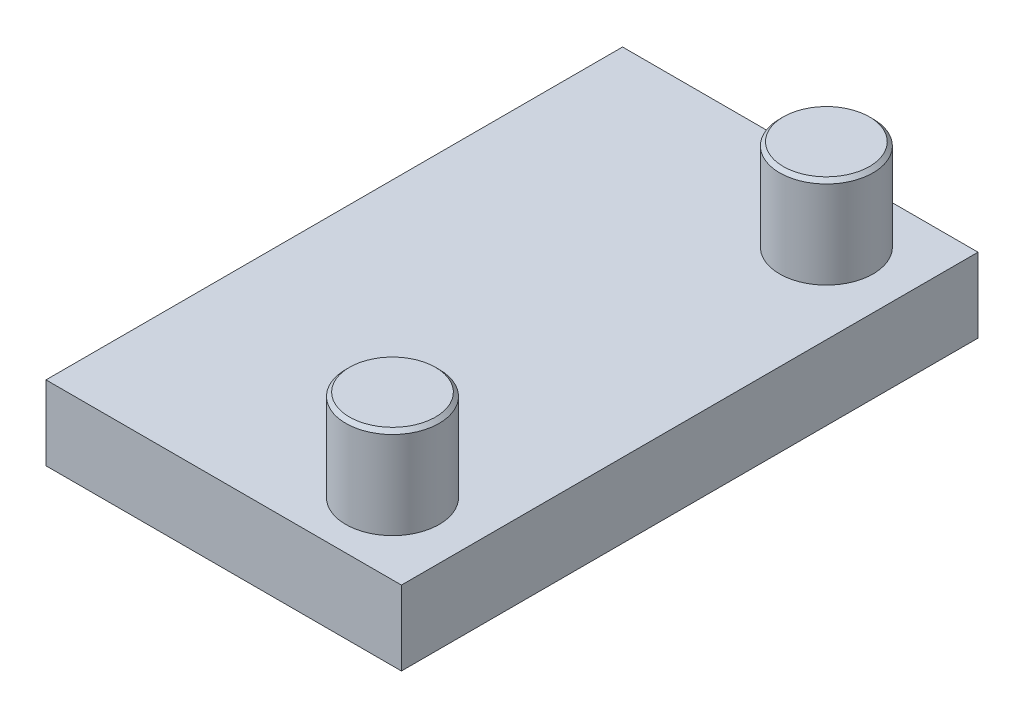
ISO-10303-21;
HEADER;
FILE_DESCRIPTION(('STEP AP214'),'2;1');
FILE_NAME('part.step','',(''),(''),'','','');
FILE_SCHEMA(('AUTOMOTIVE_DESIGN { 1 0 10303 214 1 1 1 1 }'));
ENDSEC;
DATA;
#1=APPLICATION_CONTEXT('core data for automotive mechanical design processes');
#2=APPLICATION_PROTOCOL_DEFINITION('international standard','automotive_design',2000,#1);
#3=PRODUCT_CONTEXT('',#1,'mechanical');
#4=PRODUCT('Part','Part','',(#3));
#5=PRODUCT_RELATED_PRODUCT_CATEGORY('part','',(#4));
#6=PRODUCT_DEFINITION_FORMATION('','',#4);
#7=PRODUCT_DEFINITION_CONTEXT('part definition',#1,'design');
#8=PRODUCT_DEFINITION('design','',#6,#7);
#9=PRODUCT_DEFINITION_SHAPE('','',#8);
#10=(LENGTH_UNIT() NAMED_UNIT(*) SI_UNIT(.MILLI.,.METRE.));
#11=(NAMED_UNIT(*) PLANE_ANGLE_UNIT() SI_UNIT($,.RADIAN.));
#12=(NAMED_UNIT(*) SI_UNIT($,.STERADIAN.) SOLID_ANGLE_UNIT());
#13=UNCERTAINTY_MEASURE_WITH_UNIT(LENGTH_MEASURE(1.E-05),#10,'distance_accuracy_value','');
#14=(GEOMETRIC_REPRESENTATION_CONTEXT(3) GLOBAL_UNCERTAINTY_ASSIGNED_CONTEXT((#13)) GLOBAL_UNIT_ASSIGNED_CONTEXT((#10,
#11,#12)) REPRESENTATION_CONTEXT('',''));
#15=CARTESIAN_POINT('',(0.,0.,0.));
#16=DIRECTION('',(0.,0.,1.));
#17=DIRECTION('',(1.,0.,0.));
#18=AXIS2_PLACEMENT_3D('',#15,#16,#17);
#19=CARTESIAN_POINT('',(6.1849,2.5908,10.033));
#20=DIRECTION('',(-1.,0.,0.));
#21=DIRECTION('',(0.,0.,1.));
#22=AXIS2_PLACEMENT_3D('',#19,#20,#21);
#23=PLANE('',#22);
#24=DIRECTION('',(0.,0.,-1.));
#25=VECTOR('',#24,1.);
#26=CARTESIAN_POINT('',(6.1849,0.,10.033));
#27=LINE('',#26,#25);
#28=CARTESIAN_POINT('',(6.1849,0.,10.033));
#29=VERTEX_POINT('',#28);
#30=CARTESIAN_POINT('',(6.18489999999999,0.,-10.033));
#31=VERTEX_POINT('',#30);
#32=EDGE_CURVE('E109',#29,#31,#27,.T.);
#33=ORIENTED_EDGE('',*,*,#32,.T.);
#34=DIRECTION('',(0.,-1.,0.));
#35=VECTOR('',#34,1.);
#36=CARTESIAN_POINT('',(6.18489999999999,2.5908,-10.033));
#37=LINE('',#36,#35);
#38=CARTESIAN_POINT('',(6.18489999999999,2.5908,-10.033));
#39=VERTEX_POINT('',#38);
#40=EDGE_CURVE('E101',#39,#31,#37,.T.);
#41=ORIENTED_EDGE('',*,*,#40,.F.);
#42=DIRECTION('',(0.,0.,-1.));
#43=VECTOR('',#42,1.);
#44=CARTESIAN_POINT('',(6.1849,2.5908,10.033));
#45=LINE('',#44,#43);
#46=CARTESIAN_POINT('',(6.1849,2.5908,10.033));
#47=VERTEX_POINT('',#46);
#48=EDGE_CURVE('E92',#47,#39,#45,.T.);
#49=ORIENTED_EDGE('',*,*,#48,.F.);
#50=DIRECTION('',(0.,-1.,0.));
#51=VECTOR('',#50,1.);
#52=CARTESIAN_POINT('',(6.1849,2.5908,10.033));
#53=LINE('',#52,#51);
#54=EDGE_CURVE('E106',#47,#29,#53,.T.);
#55=ORIENTED_EDGE('',*,*,#54,.T.);
#56=EDGE_LOOP('',(#33,#41,#49,#55));
#57=FACE_BOUND('',#56,.T.);
#58=ADVANCED_FACE('F41',(#57),#23,.F.);
#59=CARTESIAN_POINT('',(6.18489999999999,2.5908,-10.033));
#60=DIRECTION('',(0.,0.,1.));
#61=DIRECTION('',(1.,0.,0.));
#62=AXIS2_PLACEMENT_3D('',#59,#60,#61);
#63=PLANE('',#62);
#64=DIRECTION('',(-1.,0.,0.));
#65=VECTOR('',#64,1.);
#66=CARTESIAN_POINT('',(6.18489999999999,0.,-10.033));
#67=LINE('',#66,#65);
#68=CARTESIAN_POINT('',(-6.1849,0.,-10.033));
#69=VERTEX_POINT('',#68);
#70=EDGE_CURVE('E99',#31,#69,#67,.T.);
#71=ORIENTED_EDGE('',*,*,#70,.T.);
#72=DIRECTION('',(0.,-1.,0.));
#73=VECTOR('',#72,1.);
#74=CARTESIAN_POINT('',(-6.1849,2.5908,-10.033));
#75=LINE('',#74,#73);
#76=CARTESIAN_POINT('',(-6.1849,2.5908,-10.033));
#77=VERTEX_POINT('',#76);
#78=EDGE_CURVE('E98',#77,#69,#75,.T.);
#79=ORIENTED_EDGE('',*,*,#78,.F.);
#80=DIRECTION('',(-1.,0.,0.));
#81=VECTOR('',#80,1.);
#82=CARTESIAN_POINT('',(6.18489999999999,2.5908,-10.033));
#83=LINE('',#82,#81);
#84=EDGE_CURVE('E89',#39,#77,#83,.T.);
#85=ORIENTED_EDGE('',*,*,#84,.F.);
#86=ORIENTED_EDGE('',*,*,#40,.T.);
#87=EDGE_LOOP('',(#71,#79,#85,#86));
#88=FACE_BOUND('',#87,.T.);
#89=ADVANCED_FACE('F97',(#88),#63,.F.);
#90=CARTESIAN_POINT('',(-6.1849,2.5908,-10.033));
#91=DIRECTION('',(1.,0.,0.));
#92=DIRECTION('',(0.,0.,-1.));
#93=AXIS2_PLACEMENT_3D('',#90,#91,#92);
#94=PLANE('',#93);
#95=DIRECTION('',(0.,0.,1.));
#96=VECTOR('',#95,1.);
#97=CARTESIAN_POINT('',(-6.1849,0.,-10.033));
#98=LINE('',#97,#96);
#99=CARTESIAN_POINT('',(-6.1849,0.,10.033));
#100=VERTEX_POINT('',#99);
#101=EDGE_CURVE('E77',#69,#100,#98,.T.);
#102=ORIENTED_EDGE('',*,*,#101,.T.);
#103=DIRECTION('',(0.,-1.,0.));
#104=VECTOR('',#103,1.);
#105=CARTESIAN_POINT('',(-6.1849,2.5908,10.033));
#106=LINE('',#105,#104);
#107=CARTESIAN_POINT('',(-6.1849,2.5908,10.033));
#108=VERTEX_POINT('',#107);
#109=EDGE_CURVE('E105',#108,#100,#106,.T.);
#110=ORIENTED_EDGE('',*,*,#109,.F.);
#111=DIRECTION('',(0.,0.,1.));
#112=VECTOR('',#111,1.);
#113=CARTESIAN_POINT('',(-6.1849,2.5908,-10.033));
#114=LINE('',#113,#112);
#115=EDGE_CURVE('E91',#77,#108,#114,.T.);
#116=ORIENTED_EDGE('',*,*,#115,.F.);
#117=ORIENTED_EDGE('',*,*,#78,.T.);
#118=EDGE_LOOP('',(#102,#110,#116,#117));
#119=FACE_BOUND('',#118,.T.);
#120=ADVANCED_FACE('F102',(#119),#94,.F.);
#121=CARTESIAN_POINT('',(-6.1849,2.5908,10.033));
#122=DIRECTION('',(0.,0.,-1.));
#123=DIRECTION('',(-1.,0.,0.));
#124=AXIS2_PLACEMENT_3D('',#121,#122,#123);
#125=PLANE('',#124);
#126=DIRECTION('',(1.,0.,0.));
#127=VECTOR('',#126,1.);
#128=CARTESIAN_POINT('',(-6.1849,0.,10.033));
#129=LINE('',#128,#127);
#130=EDGE_CURVE('E85',#100,#29,#129,.T.);
#131=ORIENTED_EDGE('',*,*,#130,.T.);
#132=ORIENTED_EDGE('',*,*,#54,.F.);
#133=DIRECTION('',(1.,0.,0.));
#134=VECTOR('',#133,1.);
#135=CARTESIAN_POINT('',(-6.1849,2.5908,10.033));
#136=LINE('',#135,#134);
#137=EDGE_CURVE('E56',#108,#47,#136,.T.);
#138=ORIENTED_EDGE('',*,*,#137,.F.);
#139=ORIENTED_EDGE('',*,*,#109,.T.);
#140=EDGE_LOOP('',(#131,#132,#138,#139));
#141=FACE_BOUND('',#140,.T.);
#142=ADVANCED_FACE('F152',(#141),#125,.F.);
#143=CARTESIAN_POINT('',(0.,2.5908,0.));
#144=DIRECTION('',(0.,1.,0.));
#145=DIRECTION('',(0.,0.,1.));
#146=AXIS2_PLACEMENT_3D('',#143,#144,#145);
#147=PLANE('',#146);
#148=CARTESIAN_POINT('',(3.3909,2.5908,-7.55015));
#149=DIRECTION('',(0.,1.,0.));
#150=DIRECTION('',(0.,0.,1.));
#151=AXIS2_PLACEMENT_3D('',#148,#149,#150);
#152=CIRCLE('',#151,1.62559999999989);
#153=CARTESIAN_POINT('',(3.3909,2.5908,-5.92455000000011));
#154=VERTEX_POINT('',#153);
#155=EDGE_CURVE('E124',#154,#154,#152,.T.);
#156=ORIENTED_EDGE('',*,*,#155,.F.);
#157=EDGE_LOOP('',(#156));
#158=FACE_BOUND('',#157,.T.);
#159=CARTESIAN_POINT('',(3.3909,2.5908,7.55015));
#160=DIRECTION('',(0.,1.,0.));
#161=DIRECTION('',(0.,0.,-1.));
#162=AXIS2_PLACEMENT_3D('',#159,#160,#161);
#163=CIRCLE('',#162,1.62559999999989);
#164=CARTESIAN_POINT('',(3.3909,2.5908,5.9245500000001));
#165=VERTEX_POINT('',#164);
#166=EDGE_CURVE('E116',#165,#165,#163,.T.);
#167=ORIENTED_EDGE('',*,*,#166,.F.);
#168=EDGE_LOOP('',(#167));
#169=FACE_BOUND('',#168,.T.);
#170=ORIENTED_EDGE('',*,*,#48,.T.);
#171=ORIENTED_EDGE('',*,*,#84,.T.);
#172=ORIENTED_EDGE('',*,*,#115,.T.);
#173=ORIENTED_EDGE('',*,*,#137,.T.);
#174=EDGE_LOOP('',(#170,#171,#172,#173));
#175=FACE_BOUND('',#174,.T.);
#176=ADVANCED_FACE('F93',(#158,#169,#175),#147,.T.);
#177=CARTESIAN_POINT('',(0.,0.,0.));
#178=DIRECTION('',(0.,1.,0.));
#179=DIRECTION('',(0.,0.,1.));
#180=AXIS2_PLACEMENT_3D('',#177,#178,#179);
#181=PLANE('',#180);
#182=ORIENTED_EDGE('',*,*,#32,.F.);
#183=ORIENTED_EDGE('',*,*,#130,.F.);
#184=ORIENTED_EDGE('',*,*,#101,.F.);
#185=ORIENTED_EDGE('',*,*,#70,.F.);
#186=EDGE_LOOP('',(#182,#183,#184,#185));
#187=FACE_BOUND('',#186,.T.);
#188=ADVANCED_FACE('F160',(#187),#181,.F.);
#189=CARTESIAN_POINT('',(3.3909,5.7658,7.55015));
#190=DIRECTION('',(0.,-1.,0.));
#191=DIRECTION('',(0.,0.,-1.));
#192=AXIS2_PLACEMENT_3D('',#189,#190,#191);
#193=CYLINDRICAL_SURFACE('',#192,1.62559999999989);
#194=CARTESIAN_POINT('',(3.3909,5.63880000000001,7.55015));
#195=DIRECTION('',(0.,-1.,0.));
#196=DIRECTION('',(0.,0.,-1.));
#197=AXIS2_PLACEMENT_3D('',#194,#195,#196);
#198=CIRCLE('',#197,1.62559999999989);
#199=CARTESIAN_POINT('',(3.3909,5.63880000000001,5.9245500000001));
#200=VERTEX_POINT('',#199);
#201=EDGE_CURVE('E123',#200,#200,#198,.T.);
#202=ORIENTED_EDGE('',*,*,#201,.T.);
#203=EDGE_LOOP('',(#202));
#204=FACE_BOUND('',#203,.T.);
#205=ORIENTED_EDGE('',*,*,#166,.T.);
#206=EDGE_LOOP('',(#205));
#207=FACE_BOUND('',#206,.T.);
#208=ADVANCED_FACE('F159',(#204,#207),#193,.T.);
#209=CARTESIAN_POINT('',(3.3909,5.7658,7.55015));
#210=DIRECTION('',(0.,-1.,0.));
#211=DIRECTION('',(0.,0.,-1.));
#212=AXIS2_PLACEMENT_3D('',#209,#210,#211);
#213=PLANE('',#212);
#214=CARTESIAN_POINT('',(3.3909,5.7658,7.55015));
#215=DIRECTION('',(0.,-1.,0.));
#216=DIRECTION('',(0.,0.,-1.));
#217=AXIS2_PLACEMENT_3D('',#214,#215,#216);
#218=CIRCLE('',#217,1.4985999999999);
#219=CARTESIAN_POINT('',(3.3909,5.7658,6.0515500000001));
#220=VERTEX_POINT('',#219);
#221=EDGE_CURVE('E118',#220,#220,#218,.F.);
#222=ORIENTED_EDGE('',*,*,#221,.T.);
#223=EDGE_LOOP('',(#222));
#224=FACE_BOUND('',#223,.T.);
#225=ADVANCED_FACE('F164',(#224),#213,.F.);
#226=CARTESIAN_POINT('',(3.3909,5.7658,-7.55015));
#227=DIRECTION('',(0.,-1.,0.));
#228=DIRECTION('',(0.,0.,-1.));
#229=AXIS2_PLACEMENT_3D('',#226,#227,#228);
#230=CYLINDRICAL_SURFACE('',#229,1.62559999999989);
#231=CARTESIAN_POINT('',(3.3909,5.63880000000001,-7.55015));
#232=DIRECTION('',(0.,1.,0.));
#233=DIRECTION('',(0.,0.,1.));
#234=AXIS2_PLACEMENT_3D('',#231,#232,#233);
#235=CIRCLE('',#234,1.62559999999989);
#236=CARTESIAN_POINT('',(3.3909,5.63880000000001,-5.92455000000011));
#237=VERTEX_POINT('',#236);
#238=EDGE_CURVE('E11',#237,#237,#235,.F.);
#239=ORIENTED_EDGE('',*,*,#238,.T.);
#240=EDGE_LOOP('',(#239));
#241=FACE_BOUND('',#240,.T.);
#242=ORIENTED_EDGE('',*,*,#155,.T.);
#243=EDGE_LOOP('',(#242));
#244=FACE_BOUND('',#243,.T.);
#245=ADVANCED_FACE('F169',(#241,#244),#230,.T.);
#246=CARTESIAN_POINT('',(3.3909,5.7658,-7.55015));
#247=DIRECTION('',(0.,1.,0.));
#248=DIRECTION('',(0.,0.,1.));
#249=AXIS2_PLACEMENT_3D('',#246,#247,#248);
#250=PLANE('',#249);
#251=CARTESIAN_POINT('',(3.3909,5.7658,-7.55015));
#252=DIRECTION('',(0.,1.,0.));
#253=DIRECTION('',(0.,0.,1.));
#254=AXIS2_PLACEMENT_3D('',#251,#252,#253);
#255=CIRCLE('',#254,1.4985999999999);
#256=CARTESIAN_POINT('',(3.3909,5.7658,-6.0515500000001));
#257=VERTEX_POINT('',#256);
#258=EDGE_CURVE('E51',#257,#257,#255,.T.);
#259=ORIENTED_EDGE('',*,*,#258,.T.);
#260=EDGE_LOOP('',(#259));
#261=FACE_BOUND('',#260,.T.);
#262=ADVANCED_FACE('F129',(#261),#250,.T.);
#263=CARTESIAN_POINT('',(3.3909,5.7658,7.55015));
#264=DIRECTION('',(0.,-1.,0.));
#265=DIRECTION('',(0.,0.,-1.));
#266=AXIS2_PLACEMENT_3D('',#263,#264,#265);
#267=CONICAL_SURFACE('',#266,1.4985999999999,0.785398163397461);
#268=ORIENTED_EDGE('',*,*,#201,.F.);
#269=EDGE_LOOP('',(#268));
#270=FACE_BOUND('',#269,.T.);
#271=ORIENTED_EDGE('',*,*,#221,.F.);
#272=EDGE_LOOP('',(#271));
#273=FACE_BOUND('',#272,.T.);
#274=ADVANCED_FACE('F135',(#270,#273),#267,.T.);
#275=CARTESIAN_POINT('',(3.3909,5.7658,-7.55015));
#276=DIRECTION('',(0.,-1.,0.));
#277=DIRECTION('',(0.,0.,-1.));
#278=AXIS2_PLACEMENT_3D('',#275,#276,#277);
#279=CONICAL_SURFACE('',#278,1.4985999999999,0.785398163397461);
#280=ORIENTED_EDGE('',*,*,#238,.F.);
#281=EDGE_LOOP('',(#280));
#282=FACE_BOUND('',#281,.T.);
#283=ORIENTED_EDGE('',*,*,#258,.F.);
#284=EDGE_LOOP('',(#283));
#285=FACE_BOUND('',#284,.T.);
#286=ADVANCED_FACE('F42',(#282,#285),#279,.T.);
#287=CLOSED_SHELL('',(#58,#89,#120,#142,#176,#188,#208,#225,#245,#262,#274,#286));
#288=MANIFOLD_SOLID_BREP('B2',#287);
#289=ADVANCED_BREP_SHAPE_REPRESENTATION('',(#18,#288),#14);
#290=SHAPE_DEFINITION_REPRESENTATION(#9,#289);
ENDSEC;
END-ISO-10303-21;
